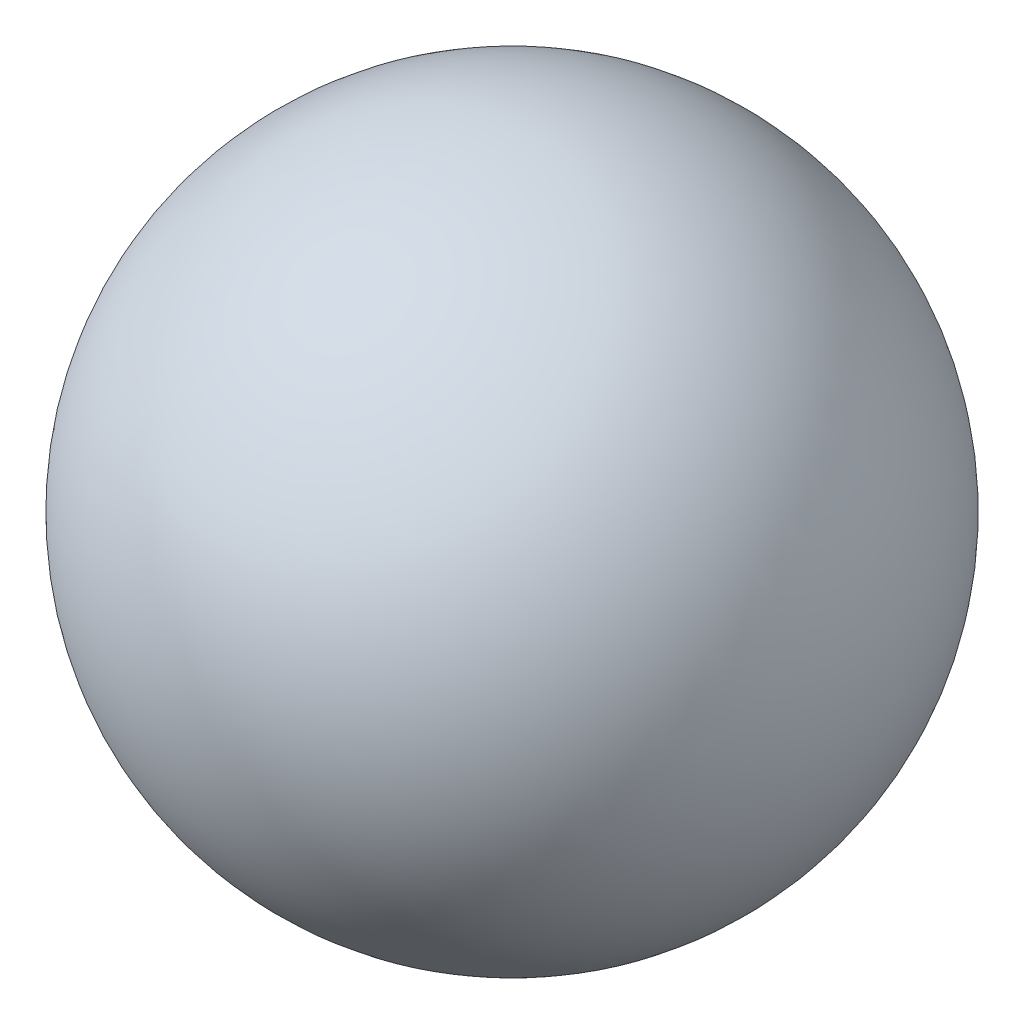
ISO-10303-21;
HEADER;
FILE_DESCRIPTION(('STEP AP214'),'2;1');
FILE_NAME('part.step','',(''),(''),'','','');
FILE_SCHEMA(('AUTOMOTIVE_DESIGN { 1 0 10303 214 1 1 1 1 }'));
ENDSEC;
DATA;
#1=APPLICATION_CONTEXT('core data for automotive mechanical design processes');
#2=APPLICATION_PROTOCOL_DEFINITION('international standard','automotive_design',2000,#1);
#3=PRODUCT_CONTEXT('',#1,'mechanical');
#4=PRODUCT('Part','Part','',(#3));
#5=PRODUCT_RELATED_PRODUCT_CATEGORY('part','',(#4));
#6=PRODUCT_DEFINITION_FORMATION('','',#4);
#7=PRODUCT_DEFINITION_CONTEXT('part definition',#1,'design');
#8=PRODUCT_DEFINITION('design','',#6,#7);
#9=PRODUCT_DEFINITION_SHAPE('','',#8);
#10=(LENGTH_UNIT() NAMED_UNIT(*) SI_UNIT(.MILLI.,.METRE.));
#11=(NAMED_UNIT(*) PLANE_ANGLE_UNIT() SI_UNIT($,.RADIAN.));
#12=(NAMED_UNIT(*) SI_UNIT($,.STERADIAN.) SOLID_ANGLE_UNIT());
#13=UNCERTAINTY_MEASURE_WITH_UNIT(LENGTH_MEASURE(1.E-05),#10,'distance_accuracy_value','');
#14=(GEOMETRIC_REPRESENTATION_CONTEXT(3) GLOBAL_UNCERTAINTY_ASSIGNED_CONTEXT((#13)) GLOBAL_UNIT_ASSIGNED_CONTEXT((#10,
#11,#12)) REPRESENTATION_CONTEXT('',''));
#15=CARTESIAN_POINT('',(0.,0.,0.));
#16=DIRECTION('',(0.,0.,1.));
#17=DIRECTION('',(1.,0.,0.));
#18=AXIS2_PLACEMENT_3D('',#15,#16,#17);
#19=CARTESIAN_POINT('',(0.,0.,0.));
#20=DIRECTION('',(0.,1.,0.));
#21=DIRECTION('',(-1.,0.,0.));
#22=AXIS2_PLACEMENT_3D('',#19,#20,#21);
#23=SPHERICAL_SURFACE('',#22,4.7625);
#24=CARTESIAN_POINT('',(0.,4.7625,0.));
#25=VERTEX_POINT('',#24);
#26=VERTEX_LOOP('',#25);
#27=FACE_BOUND('',#26,.T.);
#28=ADVANCED_FACE('F29',(#27),#23,.T.);
#29=CLOSED_SHELL('',(#28));
#30=MANIFOLD_SOLID_BREP('B2',#29);
#31=ADVANCED_BREP_SHAPE_REPRESENTATION('',(#18,#30),#14);
#32=SHAPE_DEFINITION_REPRESENTATION(#9,#31);
ENDSEC;
END-ISO-10303-21;
